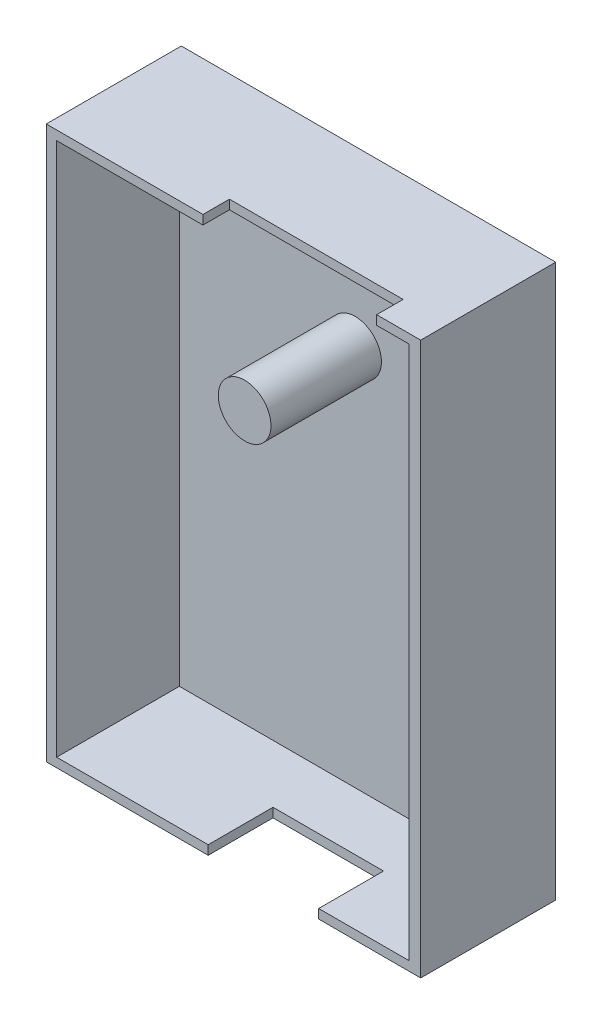
ISO-10303-21;
HEADER;
FILE_DESCRIPTION(('STEP AP214'),'2;1');
FILE_NAME('part.step','',(''),(''),'','','');
FILE_SCHEMA(('AUTOMOTIVE_DESIGN { 1 0 10303 214 1 1 1 1 }'));
ENDSEC;
DATA;
#1=APPLICATION_CONTEXT('core data for automotive mechanical design processes');
#2=APPLICATION_PROTOCOL_DEFINITION('international standard','automotive_design',2000,#1);
#3=PRODUCT_CONTEXT('',#1,'mechanical');
#4=PRODUCT('Part','Part','',(#3));
#5=PRODUCT_RELATED_PRODUCT_CATEGORY('part','',(#4));
#6=PRODUCT_DEFINITION_FORMATION('','',#4);
#7=PRODUCT_DEFINITION_CONTEXT('part definition',#1,'design');
#8=PRODUCT_DEFINITION('design','',#6,#7);
#9=PRODUCT_DEFINITION_SHAPE('','',#8);
#10=(LENGTH_UNIT() NAMED_UNIT(*) SI_UNIT(.MILLI.,.METRE.));
#11=(NAMED_UNIT(*) PLANE_ANGLE_UNIT() SI_UNIT($,.RADIAN.));
#12=(NAMED_UNIT(*) SI_UNIT($,.STERADIAN.) SOLID_ANGLE_UNIT());
#13=UNCERTAINTY_MEASURE_WITH_UNIT(LENGTH_MEASURE(1.E-05),#10,'distance_accuracy_value','');
#14=(GEOMETRIC_REPRESENTATION_CONTEXT(3) GLOBAL_UNCERTAINTY_ASSIGNED_CONTEXT((#13)) GLOBAL_UNIT_ASSIGNED_CONTEXT((#10,
#11,#12)) REPRESENTATION_CONTEXT('',''));
#15=CARTESIAN_POINT('',(0.,0.,0.));
#16=DIRECTION('',(0.,0.,1.));
#17=DIRECTION('',(1.,0.,0.));
#18=AXIS2_PLACEMENT_3D('',#15,#16,#17);
#19=CARTESIAN_POINT('',(0.,0.,22.));
#20=DIRECTION('',(0.,0.,-1.));
#21=DIRECTION('',(-1.,0.,0.));
#22=AXIS2_PLACEMENT_3D('',#19,#20,#21);
#23=PLANE('',#22);
#24=DIRECTION('',(-1.,0.,0.));
#25=VECTOR('',#24,1.);
#26=CARTESIAN_POINT('',(-19.3947637221653,24.7768128089752,22.));
#27=LINE('',#26,#25);
#28=CARTESIAN_POINT('',(4.44543358319634,24.7768128089752,22.));
#29=VERTEX_POINT('',#28);
#30=CARTESIAN_POINT('',(-19.3947637221653,24.7768128089752,22.));
#31=VERTEX_POINT('',#30);
#32=EDGE_CURVE('E220',#29,#31,#27,.T.);
#33=ORIENTED_EDGE('',*,*,#32,.F.);
#34=DIRECTION('',(0.,1.,0.));
#35=VECTOR('',#34,1.);
#36=CARTESIAN_POINT('',(4.44543358319634,0.,22.));
#37=LINE('',#36,#35);
#38=CARTESIAN_POINT('',(4.44543358319634,26.2762237762238,22.));
#39=VERTEX_POINT('',#38);
#40=EDGE_CURVE('E175',#29,#39,#37,.T.);
#41=ORIENTED_EDGE('',*,*,#40,.T.);
#42=DIRECTION('',(-1.,0.,0.));
#43=VECTOR('',#42,1.);
#44=CARTESIAN_POINT('',(-21.0839160839161,26.2762237762238,22.));
#45=LINE('',#44,#43);
#46=CARTESIAN_POINT('',(-21.0839160839161,26.2762237762238,22.));
#47=VERTEX_POINT('',#46);
#48=EDGE_CURVE('E244',#39,#47,#45,.T.);
#49=ORIENTED_EDGE('',*,*,#48,.T.);
#50=DIRECTION('',(0.,-1.,0.));
#51=VECTOR('',#50,1.);
#52=CARTESIAN_POINT('',(-21.0839160839161,-63.7237762237762,22.));
#53=LINE('',#52,#51);
#54=CARTESIAN_POINT('',(-21.0839160839161,-63.7237762237762,22.));
#55=VERTEX_POINT('',#54);
#56=EDGE_CURVE('E234',#47,#55,#53,.T.);
#57=ORIENTED_EDGE('',*,*,#56,.T.);
#58=DIRECTION('',(1.,0.,0.));
#59=VECTOR('',#58,1.);
#60=CARTESIAN_POINT('',(39.9160839160839,-63.7237762237762,22.));
#61=LINE('',#60,#59);
#62=CARTESIAN_POINT('',(5.29626535393263,-63.7237762237762,22.));
#63=VERTEX_POINT('',#62);
#64=EDGE_CURVE('E239',#55,#63,#61,.T.);
#65=ORIENTED_EDGE('',*,*,#64,.T.);
#66=DIRECTION('',(0.,1.,0.));
#67=VECTOR('',#66,1.);
#68=CARTESIAN_POINT('',(5.29626535393262,0.,22.));
#69=LINE('',#68,#67);
#70=CARTESIAN_POINT('',(5.29626535393263,-62.2243652565275,22.));
#71=VERTEX_POINT('',#70);
#72=EDGE_CURVE('E191',#63,#71,#69,.T.);
#73=ORIENTED_EDGE('',*,*,#72,.T.);
#74=DIRECTION('',(1.,0.,0.));
#75=VECTOR('',#74,1.);
#76=CARTESIAN_POINT('',(38.0373865040815,-62.2243652565275,22.));
#77=LINE('',#76,#75);
#78=CARTESIAN_POINT('',(-19.3947637221653,-62.2243652565275,22.));
#79=VERTEX_POINT('',#78);
#80=EDGE_CURVE('E214',#79,#71,#77,.T.);
#81=ORIENTED_EDGE('',*,*,#80,.F.);
#82=DIRECTION('',(0.,-1.,0.));
#83=VECTOR('',#82,1.);
#84=CARTESIAN_POINT('',(-19.3947637221653,-62.2243652565275,22.));
#85=LINE('',#84,#83);
#86=EDGE_CURVE('E197',#31,#79,#85,.T.);
#87=ORIENTED_EDGE('',*,*,#86,.F.);
#88=EDGE_LOOP('',(#33,#41,#49,#57,#65,#73,#81,#87));
#89=FACE_BOUND('',#88,.T.);
#90=ADVANCED_FACE('F37',(#89),#23,.F.);
#91=CARTESIAN_POINT('',(-21.0839160839161,-63.7237762237762,22.));
#92=DIRECTION('',(1.,0.,0.));
#93=DIRECTION('',(0.,0.,-1.));
#94=AXIS2_PLACEMENT_3D('',#91,#92,#93);
#95=PLANE('',#94);
#96=DIRECTION('',(0.,-1.,0.));
#97=VECTOR('',#96,1.);
#98=CARTESIAN_POINT('',(-21.0839160839161,-63.7237762237762,0.));
#99=LINE('',#98,#97);
#100=CARTESIAN_POINT('',(-21.0839160839161,26.2762237762238,0.));
#101=VERTEX_POINT('',#100);
#102=CARTESIAN_POINT('',(-21.0839160839161,-63.7237762237762,0.));
#103=VERTEX_POINT('',#102);
#104=EDGE_CURVE('E226',#101,#103,#99,.T.);
#105=ORIENTED_EDGE('',*,*,#104,.T.);
#106=DIRECTION('',(0.,0.,-1.));
#107=VECTOR('',#106,1.);
#108=CARTESIAN_POINT('',(-21.0839160839161,-63.7237762237762,22.));
#109=LINE('',#108,#107);
#110=EDGE_CURVE('E263',#55,#103,#109,.T.);
#111=ORIENTED_EDGE('',*,*,#110,.F.);
#112=ORIENTED_EDGE('',*,*,#56,.F.);
#113=DIRECTION('',(0.,0.,-1.));
#114=VECTOR('',#113,1.);
#115=CARTESIAN_POINT('',(-21.0839160839161,26.2762237762238,22.));
#116=LINE('',#115,#114);
#117=EDGE_CURVE('E247',#47,#101,#116,.T.);
#118=ORIENTED_EDGE('',*,*,#117,.T.);
#119=EDGE_LOOP('',(#105,#111,#112,#118));
#120=FACE_BOUND('',#119,.T.);
#121=ADVANCED_FACE('F39',(#120),#95,.F.);
#122=CARTESIAN_POINT('',(39.9160839160839,-63.7237762237762,22.));
#123=DIRECTION('',(0.,1.,0.));
#124=DIRECTION('',(-1.,0.,0.));
#125=AXIS2_PLACEMENT_3D('',#122,#123,#124);
#126=PLANE('',#125);
#127=DIRECTION('',(1.,0.,0.));
#128=VECTOR('',#127,1.);
#129=CARTESIAN_POINT('',(5.29626535393263,-63.7237762237762,11.4381086280989));
#130=LINE('',#129,#128);
#131=CARTESIAN_POINT('',(5.29626535393263,-63.7237762237762,11.4381086280989));
#132=VERTEX_POINT('',#131);
#133=CARTESIAN_POINT('',(23.2962653539326,-63.7237762237762,11.4381086280989));
#134=VERTEX_POINT('',#133);
#135=EDGE_CURVE('E180',#132,#134,#130,.T.);
#136=ORIENTED_EDGE('',*,*,#135,.F.);
#137=DIRECTION('',(0.,0.,-1.));
#138=VECTOR('',#137,1.);
#139=CARTESIAN_POINT('',(5.29626535393263,-63.7237762237762,25.4381086280989));
#140=LINE('',#139,#138);
#141=EDGE_CURVE('E178',#63,#132,#140,.T.);
#142=ORIENTED_EDGE('',*,*,#141,.F.);
#143=ORIENTED_EDGE('',*,*,#64,.F.);
#144=ORIENTED_EDGE('',*,*,#110,.T.);
#145=DIRECTION('',(1.,0.,0.));
#146=VECTOR('',#145,1.);
#147=CARTESIAN_POINT('',(39.9160839160839,-63.7237762237762,0.));
#148=LINE('',#147,#146);
#149=CARTESIAN_POINT('',(39.9160839160839,-63.7237762237762,0.));
#150=VERTEX_POINT('',#149);
#151=EDGE_CURVE('E250',#103,#150,#148,.T.);
#152=ORIENTED_EDGE('',*,*,#151,.T.);
#153=DIRECTION('',(0.,0.,-1.));
#154=VECTOR('',#153,1.);
#155=CARTESIAN_POINT('',(39.9160839160839,-63.7237762237762,22.));
#156=LINE('',#155,#154);
#157=CARTESIAN_POINT('',(39.9160839160839,-63.7237762237762,22.));
#158=VERTEX_POINT('',#157);
#159=EDGE_CURVE('E260',#158,#150,#156,.T.);
#160=ORIENTED_EDGE('',*,*,#159,.F.);
#161=CARTESIAN_POINT('',(23.2962653539326,-63.7237762237762,22.));
#162=VERTEX_POINT('',#161);
#163=EDGE_CURVE('E237',#162,#158,#61,.T.);
#164=ORIENTED_EDGE('',*,*,#163,.F.);
#165=DIRECTION('',(0.,0.,1.));
#166=VECTOR('',#165,1.);
#167=CARTESIAN_POINT('',(23.2962653539326,-63.7237762237762,11.4381086280989));
#168=LINE('',#167,#166);
#169=EDGE_CURVE('E182',#134,#162,#168,.T.);
#170=ORIENTED_EDGE('',*,*,#169,.F.);
#171=EDGE_LOOP('',(#136,#142,#143,#144,#152,#160,#164,#170));
#172=FACE_BOUND('',#171,.T.);
#173=ADVANCED_FACE('F319',(#172),#126,.F.);
#174=CARTESIAN_POINT('',(39.9160839160839,26.2762237762238,22.));
#175=DIRECTION('',(-1.,0.,0.));
#176=DIRECTION('',(0.,-1.,0.));
#177=AXIS2_PLACEMENT_3D('',#174,#175,#176);
#178=PLANE('',#177);
#179=DIRECTION('',(0.,1.,0.));
#180=VECTOR('',#179,1.);
#181=CARTESIAN_POINT('',(39.9160839160839,26.2762237762238,0.));
#182=LINE('',#181,#180);
#183=CARTESIAN_POINT('',(39.9160839160839,26.2762237762238,0.));
#184=VERTEX_POINT('',#183);
#185=EDGE_CURVE('E252',#150,#184,#182,.T.);
#186=ORIENTED_EDGE('',*,*,#185,.T.);
#187=DIRECTION('',(0.,0.,-1.));
#188=VECTOR('',#187,1.);
#189=CARTESIAN_POINT('',(39.9160839160839,26.2762237762238,22.));
#190=LINE('',#189,#188);
#191=CARTESIAN_POINT('',(39.9160839160839,26.2762237762238,22.));
#192=VERTEX_POINT('',#191);
#193=EDGE_CURVE('E257',#192,#184,#190,.T.);
#194=ORIENTED_EDGE('',*,*,#193,.F.);
#195=DIRECTION('',(0.,1.,0.));
#196=VECTOR('',#195,1.);
#197=CARTESIAN_POINT('',(39.9160839160839,26.2762237762238,22.));
#198=LINE('',#197,#196);
#199=EDGE_CURVE('E242',#158,#192,#198,.T.);
#200=ORIENTED_EDGE('',*,*,#199,.F.);
#201=ORIENTED_EDGE('',*,*,#159,.T.);
#202=EDGE_LOOP('',(#186,#194,#200,#201));
#203=FACE_BOUND('',#202,.T.);
#204=ADVANCED_FACE('F328',(#203),#178,.F.);
#205=CARTESIAN_POINT('',(-21.0839160839161,26.2762237762238,22.));
#206=DIRECTION('',(0.,-1.,0.));
#207=DIRECTION('',(0.,0.,-1.));
#208=AXIS2_PLACEMENT_3D('',#205,#206,#207);
#209=PLANE('',#208);
#210=ORIENTED_EDGE('',*,*,#48,.F.);
#211=DIRECTION('',(0.,0.,1.));
#212=VECTOR('',#211,1.);
#213=CARTESIAN_POINT('',(4.44543358319634,26.2762237762238,25.5470309554295));
#214=LINE('',#213,#212);
#215=CARTESIAN_POINT('',(4.44543358319634,26.2762237762238,17.6878488516358));
#216=VERTEX_POINT('',#215);
#217=EDGE_CURVE('E166',#216,#39,#214,.T.);
#218=ORIENTED_EDGE('',*,*,#217,.F.);
#219=DIRECTION('',(-1.,0.,0.));
#220=VECTOR('',#219,1.);
#221=CARTESIAN_POINT('',(4.44543358319634,26.2762237762238,17.6878488516358));
#222=LINE('',#221,#220);
#223=CARTESIAN_POINT('',(32.7384891568538,26.2762237762238,17.6878488516358));
#224=VERTEX_POINT('',#223);
#225=EDGE_CURVE('E152',#224,#216,#222,.T.);
#226=ORIENTED_EDGE('',*,*,#225,.F.);
#227=DIRECTION('',(0.,0.,-1.));
#228=VECTOR('',#227,1.);
#229=CARTESIAN_POINT('',(32.7384891568538,26.2762237762238,17.6878488516358));
#230=LINE('',#229,#228);
#231=CARTESIAN_POINT('',(32.7384891568538,26.2762237762238,22.));
#232=VERTEX_POINT('',#231);
#233=EDGE_CURVE('E159',#232,#224,#230,.T.);
#234=ORIENTED_EDGE('',*,*,#233,.F.);
#235=EDGE_CURVE('E245',#192,#232,#45,.T.);
#236=ORIENTED_EDGE('',*,*,#235,.F.);
#237=ORIENTED_EDGE('',*,*,#193,.T.);
#238=DIRECTION('',(-1.,0.,0.));
#239=VECTOR('',#238,1.);
#240=CARTESIAN_POINT('',(-21.0839160839161,26.2762237762238,0.));
#241=LINE('',#240,#239);
#242=EDGE_CURVE('E238',#184,#101,#241,.T.);
#243=ORIENTED_EDGE('',*,*,#242,.T.);
#244=ORIENTED_EDGE('',*,*,#117,.F.);
#245=EDGE_LOOP('',(#210,#218,#226,#234,#236,#237,#243,#244));
#246=FACE_BOUND('',#245,.T.);
#247=ADVANCED_FACE('F169',(#246),#209,.F.);
#248=ORIENTED_EDGE('',*,*,#235,.T.);
#249=DIRECTION('',(0.,-1.,0.));
#250=VECTOR('',#249,1.);
#251=CARTESIAN_POINT('',(32.7384891568538,0.,22.));
#252=LINE('',#251,#250);
#253=CARTESIAN_POINT('',(32.7384891568538,24.7768128089752,22.));
#254=VERTEX_POINT('',#253);
#255=EDGE_CURVE('E162',#232,#254,#252,.T.);
#256=ORIENTED_EDGE('',*,*,#255,.T.);
#257=CARTESIAN_POINT('',(38.0373865040815,24.7768128089752,22.));
#258=VERTEX_POINT('',#257);
#259=EDGE_CURVE('E202',#258,#254,#27,.T.);
#260=ORIENTED_EDGE('',*,*,#259,.F.);
#261=DIRECTION('',(0.,1.,0.));
#262=VECTOR('',#261,1.);
#263=CARTESIAN_POINT('',(38.0373865040815,24.7768128089752,22.));
#264=LINE('',#263,#262);
#265=CARTESIAN_POINT('',(38.0373865040815,-62.2243652565275,22.));
#266=VERTEX_POINT('',#265);
#267=EDGE_CURVE('E217',#266,#258,#264,.T.);
#268=ORIENTED_EDGE('',*,*,#267,.F.);
#269=CARTESIAN_POINT('',(23.2962653539326,-62.2243652565275,22.));
#270=VERTEX_POINT('',#269);
#271=EDGE_CURVE('E213',#270,#266,#77,.T.);
#272=ORIENTED_EDGE('',*,*,#271,.F.);
#273=DIRECTION('',(0.,-1.,0.));
#274=VECTOR('',#273,1.);
#275=CARTESIAN_POINT('',(23.2962653539326,0.,22.));
#276=LINE('',#275,#274);
#277=EDGE_CURVE('E186',#270,#162,#276,.T.);
#278=ORIENTED_EDGE('',*,*,#277,.T.);
#279=ORIENTED_EDGE('',*,*,#163,.T.);
#280=ORIENTED_EDGE('',*,*,#199,.T.);
#281=EDGE_LOOP('',(#248,#256,#260,#268,#272,#278,#279,#280));
#282=FACE_BOUND('',#281,.T.);
#283=ADVANCED_FACE('F284',(#282),#23,.F.);
#284=CARTESIAN_POINT('',(0.,0.,0.));
#285=DIRECTION('',(0.,0.,-1.));
#286=DIRECTION('',(-1.,0.,0.));
#287=AXIS2_PLACEMENT_3D('',#284,#285,#286);
#288=PLANE('',#287);
#289=ORIENTED_EDGE('',*,*,#104,.F.);
#290=ORIENTED_EDGE('',*,*,#242,.F.);
#291=ORIENTED_EDGE('',*,*,#185,.F.);
#292=ORIENTED_EDGE('',*,*,#151,.F.);
#293=EDGE_LOOP('',(#289,#290,#291,#292));
#294=FACE_BOUND('',#293,.T.);
#295=ADVANCED_FACE('F294',(#294),#288,.T.);
#296=CARTESIAN_POINT('',(-19.3947637221653,-62.2243652565275,2.));
#297=DIRECTION('',(-1.,0.,0.));
#298=DIRECTION('',(0.,0.,1.));
#299=AXIS2_PLACEMENT_3D('',#296,#297,#298);
#300=PLANE('',#299);
#301=ORIENTED_EDGE('',*,*,#86,.T.);
#302=DIRECTION('',(0.,0.,1.));
#303=VECTOR('',#302,1.);
#304=CARTESIAN_POINT('',(-19.3947637221653,-62.2243652565275,2.));
#305=LINE('',#304,#303);
#306=CARTESIAN_POINT('',(-19.3947637221653,-62.2243652565275,2.));
#307=VERTEX_POINT('',#306);
#308=EDGE_CURVE('E211',#307,#79,#305,.T.);
#309=ORIENTED_EDGE('',*,*,#308,.F.);
#310=DIRECTION('',(0.,-1.,0.));
#311=VECTOR('',#310,1.);
#312=CARTESIAN_POINT('',(-19.3947637221653,-62.2243652565275,2.));
#313=LINE('',#312,#311);
#314=CARTESIAN_POINT('',(-19.3947637221653,24.7768128089752,2.));
#315=VERTEX_POINT('',#314);
#316=EDGE_CURVE('E198',#315,#307,#313,.T.);
#317=ORIENTED_EDGE('',*,*,#316,.F.);
#318=DIRECTION('',(0.,0.,1.));
#319=VECTOR('',#318,1.);
#320=CARTESIAN_POINT('',(-19.3947637221653,24.7768128089752,2.));
#321=LINE('',#320,#319);
#322=EDGE_CURVE('E223',#315,#31,#321,.T.);
#323=ORIENTED_EDGE('',*,*,#322,.T.);
#324=EDGE_LOOP('',(#301,#309,#317,#323));
#325=FACE_BOUND('',#324,.T.);
#326=ADVANCED_FACE('F327',(#325),#300,.F.);
#327=CARTESIAN_POINT('',(-19.3947637221653,24.7768128089752,2.));
#328=DIRECTION('',(0.,1.,0.));
#329=DIRECTION('',(0.,0.,1.));
#330=AXIS2_PLACEMENT_3D('',#327,#328,#329);
#331=PLANE('',#330);
#332=DIRECTION('',(-1.,0.,0.));
#333=VECTOR('',#332,1.);
#334=CARTESIAN_POINT('',(-19.3947637221653,24.7768128089752,17.6878488516358));
#335=LINE('',#334,#333);
#336=CARTESIAN_POINT('',(32.7384891568538,24.7768128089752,17.6878488516358));
#337=VERTEX_POINT('',#336);
#338=CARTESIAN_POINT('',(4.44543358319634,24.7768128089752,17.6878488516358));
#339=VERTEX_POINT('',#338);
#340=EDGE_CURVE('E45',#337,#339,#335,.T.);
#341=ORIENTED_EDGE('',*,*,#340,.T.);
#342=DIRECTION('',(0.,0.,1.));
#343=VECTOR('',#342,1.);
#344=CARTESIAN_POINT('',(4.44543358319634,24.7768128089752,2.));
#345=LINE('',#344,#343);
#346=EDGE_CURVE('E11',#339,#29,#345,.T.);
#347=ORIENTED_EDGE('',*,*,#346,.T.);
#348=ORIENTED_EDGE('',*,*,#32,.T.);
#349=ORIENTED_EDGE('',*,*,#322,.F.);
#350=DIRECTION('',(-1.,0.,0.));
#351=VECTOR('',#350,1.);
#352=CARTESIAN_POINT('',(-19.3947637221653,24.7768128089752,2.));
#353=LINE('',#352,#351);
#354=CARTESIAN_POINT('',(38.0373865040815,24.7768128089752,2.));
#355=VERTEX_POINT('',#354);
#356=EDGE_CURVE('E208',#355,#315,#353,.T.);
#357=ORIENTED_EDGE('',*,*,#356,.F.);
#358=DIRECTION('',(0.,0.,1.));
#359=VECTOR('',#358,1.);
#360=CARTESIAN_POINT('',(38.0373865040815,24.7768128089752,2.));
#361=LINE('',#360,#359);
#362=EDGE_CURVE('E227',#355,#258,#361,.T.);
#363=ORIENTED_EDGE('',*,*,#362,.T.);
#364=ORIENTED_EDGE('',*,*,#259,.T.);
#365=DIRECTION('',(0.,0.,-1.));
#366=VECTOR('',#365,1.);
#367=CARTESIAN_POINT('',(32.7384891568538,24.7768128089752,2.));
#368=LINE('',#367,#366);
#369=EDGE_CURVE('E278',#254,#337,#368,.T.);
#370=ORIENTED_EDGE('',*,*,#369,.T.);
#371=EDGE_LOOP('',(#341,#347,#348,#349,#357,#363,#364,#370));
#372=FACE_BOUND('',#371,.T.);
#373=ADVANCED_FACE('F280',(#372),#331,.F.);
#374=CARTESIAN_POINT('',(38.0373865040815,24.7768128089752,2.));
#375=DIRECTION('',(1.,0.,0.));
#376=DIRECTION('',(0.,0.,-1.));
#377=AXIS2_PLACEMENT_3D('',#374,#375,#376);
#378=PLANE('',#377);
#379=ORIENTED_EDGE('',*,*,#267,.T.);
#380=ORIENTED_EDGE('',*,*,#362,.F.);
#381=DIRECTION('',(0.,1.,0.));
#382=VECTOR('',#381,1.);
#383=CARTESIAN_POINT('',(38.0373865040815,24.7768128089752,2.));
#384=LINE('',#383,#382);
#385=CARTESIAN_POINT('',(38.0373865040815,-62.2243652565275,2.));
#386=VERTEX_POINT('',#385);
#387=EDGE_CURVE('E205',#386,#355,#384,.T.);
#388=ORIENTED_EDGE('',*,*,#387,.F.);
#389=DIRECTION('',(0.,0.,1.));
#390=VECTOR('',#389,1.);
#391=CARTESIAN_POINT('',(38.0373865040815,-62.2243652565275,2.));
#392=LINE('',#391,#390);
#393=EDGE_CURVE('E229',#386,#266,#392,.T.);
#394=ORIENTED_EDGE('',*,*,#393,.T.);
#395=EDGE_LOOP('',(#379,#380,#388,#394));
#396=FACE_BOUND('',#395,.T.);
#397=ADVANCED_FACE('F354',(#396),#378,.F.);
#398=CARTESIAN_POINT('',(38.0373865040815,-62.2243652565275,2.));
#399=DIRECTION('',(0.,-1.,0.));
#400=DIRECTION('',(0.,0.,-1.));
#401=AXIS2_PLACEMENT_3D('',#398,#399,#400);
#402=PLANE('',#401);
#403=ORIENTED_EDGE('',*,*,#80,.T.);
#404=DIRECTION('',(0.,0.,-1.));
#405=VECTOR('',#404,1.);
#406=CARTESIAN_POINT('',(5.29626535393263,-62.2243652565275,2.));
#407=LINE('',#406,#405);
#408=CARTESIAN_POINT('',(5.29626535393263,-62.2243652565275,11.4381086280989));
#409=VERTEX_POINT('',#408);
#410=EDGE_CURVE('E275',#71,#409,#407,.T.);
#411=ORIENTED_EDGE('',*,*,#410,.T.);
#412=DIRECTION('',(1.,0.,0.));
#413=VECTOR('',#412,1.);
#414=CARTESIAN_POINT('',(38.0373865040815,-62.2243652565275,11.4381086280989));
#415=LINE('',#414,#413);
#416=CARTESIAN_POINT('',(23.2962653539326,-62.2243652565275,11.4381086280989));
#417=VERTEX_POINT('',#416);
#418=EDGE_CURVE('E269',#409,#417,#415,.T.);
#419=ORIENTED_EDGE('',*,*,#418,.T.);
#420=DIRECTION('',(0.,0.,1.));
#421=VECTOR('',#420,1.);
#422=CARTESIAN_POINT('',(23.2962653539326,-62.2243652565275,1.99999999999999));
#423=LINE('',#422,#421);
#424=EDGE_CURVE('E272',#417,#270,#423,.T.);
#425=ORIENTED_EDGE('',*,*,#424,.T.);
#426=ORIENTED_EDGE('',*,*,#271,.T.);
#427=ORIENTED_EDGE('',*,*,#393,.F.);
#428=DIRECTION('',(1.,0.,0.));
#429=VECTOR('',#428,1.);
#430=CARTESIAN_POINT('',(38.0373865040815,-62.2243652565275,2.));
#431=LINE('',#430,#429);
#432=EDGE_CURVE('E201',#307,#386,#431,.T.);
#433=ORIENTED_EDGE('',*,*,#432,.F.);
#434=ORIENTED_EDGE('',*,*,#308,.T.);
#435=EDGE_LOOP('',(#403,#411,#419,#425,#426,#427,#433,#434));
#436=FACE_BOUND('',#435,.T.);
#437=ADVANCED_FACE('F346',(#436),#402,.F.);
#438=CARTESIAN_POINT('',(0.,0.,2.));
#439=DIRECTION('',(0.,0.,-1.));
#440=DIRECTION('',(-1.,0.,0.));
#441=AXIS2_PLACEMENT_3D('',#438,#439,#440);
#442=PLANE('',#441);
#443=CARTESIAN_POINT('',(9.23381050827948,0.,2.));
#444=DIRECTION('',(0.,0.,-1.));
#445=DIRECTION('',(-1.,0.,0.));
#446=AXIS2_PLACEMENT_3D('',#443,#444,#445);
#447=CIRCLE('',#446,4.28811347752778);
#448=CARTESIAN_POINT('',(4.9456970307517,0.,2.));
#449=VERTEX_POINT('',#448);
#450=EDGE_CURVE('E266',#449,#449,#447,.F.);
#451=ORIENTED_EDGE('',*,*,#450,.F.);
#452=EDGE_LOOP('',(#451));
#453=FACE_BOUND('',#452,.T.);
#454=ORIENTED_EDGE('',*,*,#316,.T.);
#455=ORIENTED_EDGE('',*,*,#432,.T.);
#456=ORIENTED_EDGE('',*,*,#387,.T.);
#457=ORIENTED_EDGE('',*,*,#356,.T.);
#458=EDGE_LOOP('',(#454,#455,#456,#457));
#459=FACE_BOUND('',#458,.T.);
#460=ADVANCED_FACE('F357',(#453,#459),#442,.F.);
#461=CARTESIAN_POINT('',(9.23381050827948,0.,20.));
#462=DIRECTION('',(0.,0.,-1.));
#463=DIRECTION('',(-1.,0.,0.));
#464=AXIS2_PLACEMENT_3D('',#461,#462,#463);
#465=CYLINDRICAL_SURFACE('',#464,4.28811347752778);
#466=CARTESIAN_POINT('',(9.23381050827948,0.,20.));
#467=DIRECTION('',(0.,0.,1.));
#468=DIRECTION('',(1.,0.,0.));
#469=AXIS2_PLACEMENT_3D('',#466,#467,#468);
#470=CIRCLE('',#469,4.28811347752778);
#471=CARTESIAN_POINT('',(13.5219239858073,0.,20.));
#472=VERTEX_POINT('',#471);
#473=EDGE_CURVE('E194',#472,#472,#470,.T.);
#474=ORIENTED_EDGE('',*,*,#473,.F.);
#475=EDGE_LOOP('',(#474));
#476=FACE_BOUND('',#475,.T.);
#477=ORIENTED_EDGE('',*,*,#450,.T.);
#478=EDGE_LOOP('',(#477));
#479=FACE_BOUND('',#478,.T.);
#480=ADVANCED_FACE('F372',(#476,#479),#465,.T.);
#481=CARTESIAN_POINT('',(9.23381050827948,0.,20.));
#482=DIRECTION('',(0.,0.,1.));
#483=DIRECTION('',(1.,0.,0.));
#484=AXIS2_PLACEMENT_3D('',#481,#482,#483);
#485=PLANE('',#484);
#486=ORIENTED_EDGE('',*,*,#473,.T.);
#487=EDGE_LOOP('',(#486));
#488=FACE_BOUND('',#487,.T.);
#489=ADVANCED_FACE('F376',(#488),#485,.T.);
#490=CARTESIAN_POINT('',(5.29626535393263,-59.7237762237762,25.4381086280989));
#491=DIRECTION('',(-1.,0.,0.));
#492=DIRECTION('',(0.,-1.,0.));
#493=AXIS2_PLACEMENT_3D('',#490,#491,#492);
#494=PLANE('',#493);
#495=ORIENTED_EDGE('',*,*,#141,.T.);
#496=DIRECTION('',(0.,-1.,0.));
#497=VECTOR('',#496,1.);
#498=CARTESIAN_POINT('',(5.29626535393263,-59.7237762237762,11.4381086280989));
#499=LINE('',#498,#497);
#500=EDGE_CURVE('E184',#409,#132,#499,.T.);
#501=ORIENTED_EDGE('',*,*,#500,.F.);
#502=ORIENTED_EDGE('',*,*,#410,.F.);
#503=ORIENTED_EDGE('',*,*,#72,.F.);
#504=EDGE_LOOP('',(#495,#501,#502,#503));
#505=FACE_BOUND('',#504,.T.);
#506=ADVANCED_FACE('F344',(#505),#494,.F.);
#507=CARTESIAN_POINT('',(23.2962653539326,-59.7237762237762,11.4381086280989));
#508=DIRECTION('',(1.,0.,0.));
#509=DIRECTION('',(0.,0.,-1.));
#510=AXIS2_PLACEMENT_3D('',#507,#508,#509);
#511=PLANE('',#510);
#512=ORIENTED_EDGE('',*,*,#424,.F.);
#513=DIRECTION('',(0.,-1.,0.));
#514=VECTOR('',#513,1.);
#515=CARTESIAN_POINT('',(23.2962653539326,-59.7237762237762,11.4381086280989));
#516=LINE('',#515,#514);
#517=EDGE_CURVE('E60',#417,#134,#516,.T.);
#518=ORIENTED_EDGE('',*,*,#517,.T.);
#519=ORIENTED_EDGE('',*,*,#169,.T.);
#520=ORIENTED_EDGE('',*,*,#277,.F.);
#521=EDGE_LOOP('',(#512,#518,#519,#520));
#522=FACE_BOUND('',#521,.T.);
#523=ADVANCED_FACE('F310',(#522),#511,.F.);
#524=CARTESIAN_POINT('',(5.29626535393263,-59.7237762237762,11.4381086280989));
#525=DIRECTION('',(0.,0.,-1.));
#526=DIRECTION('',(-1.,0.,0.));
#527=AXIS2_PLACEMENT_3D('',#524,#525,#526);
#528=PLANE('',#527);
#529=ORIENTED_EDGE('',*,*,#500,.T.);
#530=ORIENTED_EDGE('',*,*,#135,.T.);
#531=ORIENTED_EDGE('',*,*,#517,.F.);
#532=ORIENTED_EDGE('',*,*,#418,.F.);
#533=EDGE_LOOP('',(#529,#530,#531,#532));
#534=FACE_BOUND('',#533,.T.);
#535=ADVANCED_FACE('F303',(#534),#528,.F.);
#536=CARTESIAN_POINT('',(4.44543358319634,22.2762237762238,25.5470309554295));
#537=DIRECTION('',(-1.,0.,0.));
#538=DIRECTION('',(0.,0.,1.));
#539=AXIS2_PLACEMENT_3D('',#536,#537,#538);
#540=PLANE('',#539);
#541=ORIENTED_EDGE('',*,*,#346,.F.);
#542=DIRECTION('',(0.,1.,0.));
#543=VECTOR('',#542,1.);
#544=CARTESIAN_POINT('',(4.44543358319634,22.2762237762238,17.6878488516358));
#545=LINE('',#544,#543);
#546=EDGE_CURVE('E156',#339,#216,#545,.T.);
#547=ORIENTED_EDGE('',*,*,#546,.T.);
#548=ORIENTED_EDGE('',*,*,#217,.T.);
#549=ORIENTED_EDGE('',*,*,#40,.F.);
#550=EDGE_LOOP('',(#541,#547,#548,#549));
#551=FACE_BOUND('',#550,.T.);
#552=ADVANCED_FACE('F301',(#551),#540,.F.);
#553=CARTESIAN_POINT('',(4.44543358319634,22.2762237762238,17.6878488516358));
#554=DIRECTION('',(0.,0.,-1.));
#555=DIRECTION('',(-1.,0.,0.));
#556=AXIS2_PLACEMENT_3D('',#553,#554,#555);
#557=PLANE('',#556);
#558=DIRECTION('',(0.,1.,0.));
#559=VECTOR('',#558,1.);
#560=CARTESIAN_POINT('',(32.7384891568538,22.2762237762238,17.6878488516358));
#561=LINE('',#560,#559);
#562=EDGE_CURVE('E52',#337,#224,#561,.T.);
#563=ORIENTED_EDGE('',*,*,#562,.T.);
#564=ORIENTED_EDGE('',*,*,#225,.T.);
#565=ORIENTED_EDGE('',*,*,#546,.F.);
#566=ORIENTED_EDGE('',*,*,#340,.F.);
#567=EDGE_LOOP('',(#563,#564,#565,#566));
#568=FACE_BOUND('',#567,.T.);
#569=ADVANCED_FACE('F149',(#568),#557,.F.);
#570=CARTESIAN_POINT('',(32.7384891568538,22.2762237762238,17.6878488516358));
#571=DIRECTION('',(1.,0.,0.));
#572=DIRECTION('',(0.,0.,-1.));
#573=AXIS2_PLACEMENT_3D('',#570,#571,#572);
#574=PLANE('',#573);
#575=ORIENTED_EDGE('',*,*,#233,.T.);
#576=ORIENTED_EDGE('',*,*,#562,.F.);
#577=ORIENTED_EDGE('',*,*,#369,.F.);
#578=ORIENTED_EDGE('',*,*,#255,.F.);
#579=EDGE_LOOP('',(#575,#576,#577,#578));
#580=FACE_BOUND('',#579,.T.);
#581=ADVANCED_FACE('F160',(#580),#574,.F.);
#582=CLOSED_SHELL('',(#90,#121,#173,#204,#247,#283,#295,#326,#373,#397,#437,#460,#480,#489,#506,
#523,#535,#552,#569,#581));
#583=MANIFOLD_SOLID_BREP('B2',#582);
#584=ADVANCED_BREP_SHAPE_REPRESENTATION('',(#18,#583),#14);
#585=SHAPE_DEFINITION_REPRESENTATION(#9,#584);
ENDSEC;
END-ISO-10303-21;
